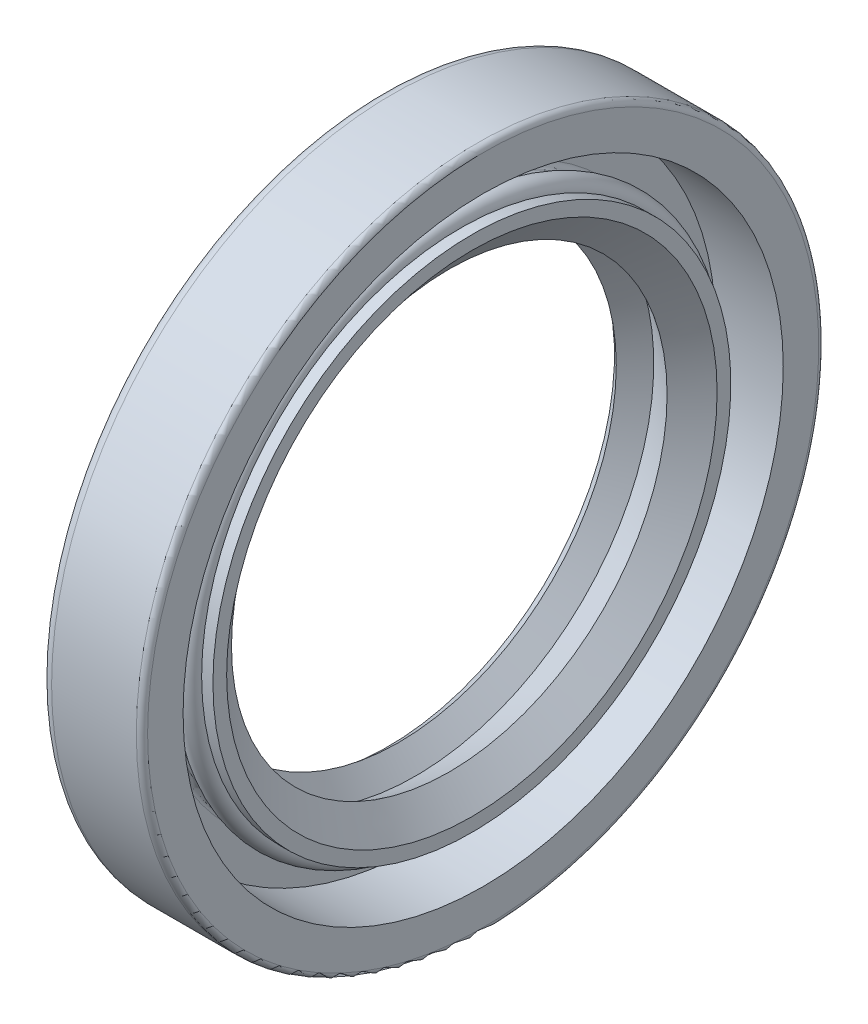
ISO-10303-21;
HEADER;
FILE_DESCRIPTION(('STEP AP214'),'2;1');
FILE_NAME('part.step','',(''),(''),'','','');
FILE_SCHEMA(('AUTOMOTIVE_DESIGN { 1 0 10303 214 1 1 1 1 }'));
ENDSEC;
DATA;
#1=APPLICATION_CONTEXT('core data for automotive mechanical design processes');
#2=APPLICATION_PROTOCOL_DEFINITION('international standard','automotive_design',2000,#1);
#3=PRODUCT_CONTEXT('',#1,'mechanical');
#4=PRODUCT('Part','Part','',(#3));
#5=PRODUCT_RELATED_PRODUCT_CATEGORY('part','',(#4));
#6=PRODUCT_DEFINITION_FORMATION('','',#4);
#7=PRODUCT_DEFINITION_CONTEXT('part definition',#1,'design');
#8=PRODUCT_DEFINITION('design','',#6,#7);
#9=PRODUCT_DEFINITION_SHAPE('','',#8);
#10=(LENGTH_UNIT() NAMED_UNIT(*) SI_UNIT(.MILLI.,.METRE.));
#11=(NAMED_UNIT(*) PLANE_ANGLE_UNIT() SI_UNIT($,.RADIAN.));
#12=(NAMED_UNIT(*) SI_UNIT($,.STERADIAN.) SOLID_ANGLE_UNIT());
#13=UNCERTAINTY_MEASURE_WITH_UNIT(LENGTH_MEASURE(1.E-05),#10,'distance_accuracy_value','');
#14=(GEOMETRIC_REPRESENTATION_CONTEXT(3) GLOBAL_UNCERTAINTY_ASSIGNED_CONTEXT((#13)) GLOBAL_UNIT_ASSIGNED_CONTEXT((#10,
#11,#12)) REPRESENTATION_CONTEXT('',''));
#15=CARTESIAN_POINT('',(0.,0.,0.));
#16=DIRECTION('',(0.,0.,1.));
#17=DIRECTION('',(1.,0.,0.));
#18=AXIS2_PLACEMENT_3D('',#15,#16,#17);
#19=CARTESIAN_POINT('',(0.,-23.144318032822,-22.722222222222));
#20=DIRECTION('',(-1.,0.,0.));
#21=DIRECTION('',(0.,0.,1.));
#22=AXIS2_PLACEMENT_3D('',#19,#20,#21);
#23=PLANE('',#22);
#24=CARTESIAN_POINT('',(0.,0.,0.));
#25=DIRECTION('',(-1.,0.,0.));
#26=DIRECTION('',(0.,0.,-1.));
#27=AXIS2_PLACEMENT_3D('',#24,#25,#26);
#28=CIRCLE('',#27,22.7222222588722);
#29=CARTESIAN_POINT('',(0.,0.,-22.7222222588722));
#30=VERTEX_POINT('',#29);
#31=EDGE_CURVE('E86',#30,#30,#28,.F.);
#32=ORIENTED_EDGE('',*,*,#31,.F.);
#33=EDGE_LOOP('',(#32));
#34=FACE_BOUND('',#33,.T.);
#35=CARTESIAN_POINT('',(0.,0.,0.));
#36=DIRECTION('',(1.,0.,0.));
#37=DIRECTION('',(0.,-1.16841538594905E-09,1.));
#38=AXIS2_PLACEMENT_3D('',#35,#36,#37);
#39=CIRCLE('',#38,20.666666666667);
#40=CARTESIAN_POINT('',(0.,-2.41472513096141E-08,20.666666666667));
#41=VERTEX_POINT('',#40);
#42=EDGE_CURVE('E83',#41,#41,#39,.T.);
#43=ORIENTED_EDGE('',*,*,#42,.T.);
#44=EDGE_LOOP('',(#43));
#45=FACE_BOUND('',#44,.T.);
#46=ADVANCED_FACE('F15',(#34,#45),#23,.T.);
#47=CARTESIAN_POINT('',(0.2,-21.0505777706846,-20.666666666667));
#48=DIRECTION('',(-1.,0.,0.));
#49=DIRECTION('',(0.,0.,1.));
#50=AXIS2_PLACEMENT_3D('',#47,#48,#49);
#51=PLANE('',#50);
#52=CARTESIAN_POINT('',(0.2,0.,0.));
#53=DIRECTION('',(-1.,0.,0.));
#54=DIRECTION('',(0.,0.,-1.));
#55=AXIS2_PLACEMENT_3D('',#52,#53,#54);
#56=CIRCLE('',#55,20.666666666667);
#57=CARTESIAN_POINT('',(0.2,0.,-20.666666666667));
#58=VERTEX_POINT('',#57);
#59=EDGE_CURVE('E80',#58,#58,#56,.F.);
#60=ORIENTED_EDGE('',*,*,#59,.F.);
#61=EDGE_LOOP('',(#60));
#62=FACE_BOUND('',#61,.T.);
#63=CARTESIAN_POINT('',(0.2,0.,0.));
#64=DIRECTION('',(1.,0.,0.));
#65=DIRECTION('',(0.,0.,1.));
#66=AXIS2_PLACEMENT_3D('',#63,#64,#65);
#67=CIRCLE('',#66,17.833333333333);
#68=CARTESIAN_POINT('',(0.2,0.,17.833333333333));
#69=VERTEX_POINT('',#68);
#70=EDGE_CURVE('E77',#69,#69,#67,.T.);
#71=ORIENTED_EDGE('',*,*,#70,.T.);
#72=EDGE_LOOP('',(#71));
#73=FACE_BOUND('',#72,.T.);
#74=ADVANCED_FACE('F94',(#62,#73),#51,.T.);
#75=CARTESIAN_POINT('',(0.,-18.164611452917,-17.833333333333));
#76=DIRECTION('',(-1.,0.,0.));
#77=DIRECTION('',(0.,0.,1.));
#78=AXIS2_PLACEMENT_3D('',#75,#76,#77);
#79=PLANE('',#78);
#80=CARTESIAN_POINT('',(0.,0.,0.));
#81=DIRECTION('',(-1.,0.,0.));
#82=DIRECTION('',(0.,0.,-1.));
#83=AXIS2_PLACEMENT_3D('',#80,#81,#82);
#84=CIRCLE('',#83,17.833333333333);
#85=CARTESIAN_POINT('',(0.,0.,-17.833333333333));
#86=VERTEX_POINT('',#85);
#87=EDGE_CURVE('E74',#86,#86,#84,.F.);
#88=ORIENTED_EDGE('',*,*,#87,.F.);
#89=EDGE_LOOP('',(#88));
#90=FACE_BOUND('',#89,.T.);
#91=CARTESIAN_POINT('',(0.,0.,0.));
#92=DIRECTION('',(1.,0.,0.));
#93=DIRECTION('',(0.,0.,1.));
#94=AXIS2_PLACEMENT_3D('',#91,#92,#93);
#95=CIRCLE('',#94,17.125);
#96=CARTESIAN_POINT('',(0.,0.,17.125));
#97=VERTEX_POINT('',#96);
#98=EDGE_CURVE('E71',#97,#97,#95,.T.);
#99=ORIENTED_EDGE('',*,*,#98,.T.);
#100=EDGE_LOOP('',(#99));
#101=FACE_BOUND('',#100,.T.);
#102=ADVANCED_FACE('F285',(#90,#101),#79,.T.);
#103=CARTESIAN_POINT('',(6.2222223333333,-18.1646114634127,17.833333333333));
#104=DIRECTION('',(1.,0.,0.));
#105=DIRECTION('',(0.,0.,-1.));
#106=AXIS2_PLACEMENT_3D('',#103,#104,#105);
#107=PLANE('',#106);
#108=CARTESIAN_POINT('',(6.2222223333333,0.,0.));
#109=DIRECTION('',(1.,0.,0.));
#110=DIRECTION('',(0.,0.,1.));
#111=AXIS2_PLACEMENT_3D('',#108,#109,#110);
#112=CIRCLE('',#111,17.833333333333);
#113=CARTESIAN_POINT('',(6.2222223333333,0.,17.833333333333));
#114=VERTEX_POINT('',#113);
#115=EDGE_CURVE('E68',#114,#114,#112,.T.);
#116=ORIENTED_EDGE('',*,*,#115,.T.);
#117=EDGE_LOOP('',(#116));
#118=FACE_BOUND('',#117,.T.);
#119=CARTESIAN_POINT('',(6.2222223333333,0.,0.));
#120=DIRECTION('',(-1.,0.,0.));
#121=DIRECTION('',(0.,0.,-1.));
#122=AXIS2_PLACEMENT_3D('',#119,#120,#121);
#123=CIRCLE('',#122,16.88888902381);
#124=CARTESIAN_POINT('',(6.2222223333333,0.,-16.88888902381));
#125=VERTEX_POINT('',#124);
#126=EDGE_CURVE('E65',#125,#125,#123,.F.);
#127=ORIENTED_EDGE('',*,*,#126,.F.);
#128=EDGE_LOOP('',(#127));
#129=FACE_BOUND('',#128,.T.);
#130=ADVANCED_FACE('F276',(#118,#129),#107,.T.);
#131=CARTESIAN_POINT('',(2.3333333333333,-21.0505777347274,20.666666666667));
#132=DIRECTION('',(1.,0.,0.));
#133=DIRECTION('',(0.,0.,-1.));
#134=AXIS2_PLACEMENT_3D('',#131,#132,#133);
#135=PLANE('',#134);
#136=CARTESIAN_POINT('',(2.3333333333333,0.,0.));
#137=DIRECTION('',(1.,0.,0.));
#138=DIRECTION('',(0.,-1.16855669227054E-09,1.));
#139=AXIS2_PLACEMENT_3D('',#136,#137,#138);
#140=CIRCLE('',#139,20.666666666667);
#141=CARTESIAN_POINT('',(2.3333333333333,-2.41501716402581E-08,20.666666666667));
#142=VERTEX_POINT('',#141);
#143=EDGE_CURVE('E62',#142,#142,#140,.T.);
#144=ORIENTED_EDGE('',*,*,#143,.T.);
#145=EDGE_LOOP('',(#144));
#146=FACE_BOUND('',#145,.T.);
#147=CARTESIAN_POINT('',(2.3333333333333,0.,0.));
#148=DIRECTION('',(-1.,0.,0.));
#149=DIRECTION('',(0.,0.,-1.));
#150=AXIS2_PLACEMENT_3D('',#147,#148,#149);
#151=CIRCLE('',#150,18.222222333333);
#152=CARTESIAN_POINT('',(2.3333333333333,0.,-18.222222333333));
#153=VERTEX_POINT('',#152);
#154=EDGE_CURVE('E59',#153,#153,#151,.F.);
#155=ORIENTED_EDGE('',*,*,#154,.F.);
#156=EDGE_LOOP('',(#155));
#157=FACE_BOUND('',#156,.T.);
#158=ADVANCED_FACE('F112',(#146,#157),#135,.T.);
#159=CARTESIAN_POINT('',(7.,-23.5404310553887,23.111111111111));
#160=DIRECTION('',(1.,0.,0.));
#161=DIRECTION('',(0.,0.,-1.));
#162=AXIS2_PLACEMENT_3D('',#159,#160,#161);
#163=PLANE('',#162);
#164=CARTESIAN_POINT('',(7.,0.,0.));
#165=DIRECTION('',(1.,0.,0.));
#166=DIRECTION('',(0.,0.,1.));
#167=AXIS2_PLACEMENT_3D('',#164,#165,#166);
#168=CIRCLE('',#167,23.1111111350048);
#169=CARTESIAN_POINT('',(7.,0.,23.1111111350048));
#170=VERTEX_POINT('',#169);
#171=EDGE_CURVE('E56',#170,#170,#168,.T.);
#172=ORIENTED_EDGE('',*,*,#171,.T.);
#173=EDGE_LOOP('',(#172));
#174=FACE_BOUND('',#173,.T.);
#175=CARTESIAN_POINT('',(7.,0.,0.));
#176=DIRECTION('',(-1.,0.,0.));
#177=DIRECTION('',(0.,0.,-1.));
#178=AXIS2_PLACEMENT_3D('',#175,#176,#177);
#179=CIRCLE('',#178,20.666666666667);
#180=CARTESIAN_POINT('',(7.,0.,-20.666666666667));
#181=VERTEX_POINT('',#180);
#182=EDGE_CURVE('E53',#181,#181,#179,.F.);
#183=ORIENTED_EDGE('',*,*,#182,.F.);
#184=EDGE_LOOP('',(#183));
#185=FACE_BOUND('',#184,.T.);
#186=ADVANCED_FACE('F101',(#174,#185),#163,.T.);
#187=CARTESIAN_POINT('',(7.,0.,0.));
#188=DIRECTION('',(1.,0.,0.));
#189=DIRECTION('',(0.,0.,1.));
#190=AXIS2_PLACEMENT_3D('',#187,#188,#189);
#191=CYLINDRICAL_SURFACE('',#190,20.666666666667);
#192=ORIENTED_EDGE('',*,*,#59,.T.);
#193=EDGE_LOOP('',(#192));
#194=FACE_BOUND('',#193,.T.);
#195=ORIENTED_EDGE('',*,*,#42,.F.);
#196=EDGE_LOOP('',(#195));
#197=FACE_BOUND('',#196,.T.);
#198=ADVANCED_FACE('F98',(#194,#197),#191,.F.);
#199=CARTESIAN_POINT('',(7.,0.,0.));
#200=DIRECTION('',(1.,0.,0.));
#201=DIRECTION('',(0.,1.16844279841197E-09,1.));
#202=AXIS2_PLACEMENT_3D('',#199,#200,#201);
#203=CYLINDRICAL_SURFACE('',#202,17.833333333333);
#204=ORIENTED_EDGE('',*,*,#87,.T.);
#205=EDGE_LOOP('',(#204));
#206=FACE_BOUND('',#205,.T.);
#207=ORIENTED_EDGE('',*,*,#70,.F.);
#208=EDGE_LOOP('',(#207));
#209=FACE_BOUND('',#208,.T.);
#210=ADVANCED_FACE('F100',(#206,#209),#203,.T.);
#211=CARTESIAN_POINT('',(0.,0.,0.));
#212=DIRECTION('',(-1.,0.,0.));
#213=DIRECTION('',(0.,0.,-1.));
#214=AXIS2_PLACEMENT_3D('',#211,#212,#213);
#215=CONICAL_SURFACE('',#214,17.125,0.545655054526771);
#216=ORIENTED_EDGE('',*,*,#98,.F.);
#217=EDGE_LOOP('',(#216));
#218=FACE_BOUND('',#217,.T.);
#219=CARTESIAN_POINT('',(1.1666666666667,0.,0.));
#220=DIRECTION('',(1.,0.,0.));
#221=DIRECTION('',(0.,0.,1.));
#222=AXIS2_PLACEMENT_3D('',#219,#220,#221);
#223=CIRCLE('',#222,16.416666666667);
#224=CARTESIAN_POINT('',(1.1666666666667,0.,16.416666666667));
#225=VERTEX_POINT('',#224);
#226=EDGE_CURVE('E50',#225,#225,#223,.T.);
#227=ORIENTED_EDGE('',*,*,#226,.T.);
#228=EDGE_LOOP('',(#227));
#229=FACE_BOUND('',#228,.T.);
#230=ADVANCED_FACE('F109',(#218,#229),#215,.F.);
#231=CARTESIAN_POINT('',(1.1666666666667,0.,0.));
#232=DIRECTION('',(1.,0.,0.));
#233=DIRECTION('',(0.,0.,1.));
#234=AXIS2_PLACEMENT_3D('',#231,#232,#233);
#235=CONICAL_SURFACE('',#234,16.416666666667,0.881871938580375);
#236=CARTESIAN_POINT('',(0.471477663230241,0.,0.));
#237=DIRECTION('',(1.,0.,0.));
#238=DIRECTION('',(0.,0.,1.));
#239=AXIS2_PLACEMENT_3D('',#236,#237,#238);
#240=CIRCLE('',#239,15.572508591065);
#241=CARTESIAN_POINT('',(0.471477663230241,0.,15.572508591065));
#242=VERTEX_POINT('',#241);
#243=EDGE_CURVE('E47',#242,#242,#240,.T.);
#244=ORIENTED_EDGE('',*,*,#243,.T.);
#245=EDGE_LOOP('',(#244));
#246=FACE_BOUND('',#245,.T.);
#247=ORIENTED_EDGE('',*,*,#226,.F.);
#248=EDGE_LOOP('',(#247));
#249=FACE_BOUND('',#248,.T.);
#250=ADVANCED_FACE('F119',(#246,#249),#235,.T.);
#251=CARTESIAN_POINT('',(0.471477663230238,0.,0.));
#252=DIRECTION('',(-1.,0.,0.));
#253=DIRECTION('',(0.,0.,-1.));
#254=AXIS2_PLACEMENT_3D('',#251,#252,#253);
#255=CONICAL_SURFACE('',#254,15.572508591065,0.688924388214588);
#256=ORIENTED_EDGE('',*,*,#243,.F.);
#257=EDGE_LOOP('',(#256));
#258=FACE_BOUND('',#257,.T.);
#259=CARTESIAN_POINT('',(1.1666666666667,0.,0.));
#260=DIRECTION('',(1.,0.,0.));
#261=DIRECTION('',(0.,0.,1.));
#262=AXIS2_PLACEMENT_3D('',#259,#260,#261);
#263=CIRCLE('',#262,15.);
#264=CARTESIAN_POINT('',(1.1666666666667,0.,15.));
#265=VERTEX_POINT('',#264);
#266=EDGE_CURVE('E44',#265,#265,#263,.T.);
#267=ORIENTED_EDGE('',*,*,#266,.T.);
#268=EDGE_LOOP('',(#267));
#269=FACE_BOUND('',#268,.T.);
#270=ADVANCED_FACE('F123',(#258,#269),#255,.F.);
#271=CARTESIAN_POINT('',(2.3333333333333,0.,0.));
#272=DIRECTION('',(1.,0.,0.));
#273=DIRECTION('',(0.,0.,1.));
#274=AXIS2_PLACEMENT_3D('',#271,#272,#273);
#275=CONICAL_SURFACE('',#274,16.416666666667,0.881871938580179);
#276=CARTESIAN_POINT('',(2.3333333333333,0.,0.));
#277=DIRECTION('',(1.,0.,0.));
#278=DIRECTION('',(0.,0.,1.));
#279=AXIS2_PLACEMENT_3D('',#276,#277,#278);
#280=CIRCLE('',#279,16.416666666667);
#281=CARTESIAN_POINT('',(2.3333333333333,0.,16.416666666667));
#282=VERTEX_POINT('',#281);
#283=EDGE_CURVE('E41',#282,#282,#280,.T.);
#284=ORIENTED_EDGE('',*,*,#283,.T.);
#285=EDGE_LOOP('',(#284));
#286=FACE_BOUND('',#285,.T.);
#287=ORIENTED_EDGE('',*,*,#266,.F.);
#288=EDGE_LOOP('',(#287));
#289=FACE_BOUND('',#288,.T.);
#290=ADVANCED_FACE('F127',(#286,#289),#275,.F.);
#291=CARTESIAN_POINT('',(2.33333333333329,0.,0.));
#292=DIRECTION('',(-1.,0.,0.));
#293=DIRECTION('',(0.,0.,-1.));
#294=AXIS2_PLACEMENT_3D('',#291,#292,#293);
#295=CONICAL_SURFACE('',#294,16.416666666667,0.545655054527085);
#296=ORIENTED_EDGE('',*,*,#283,.F.);
#297=EDGE_LOOP('',(#296));
#298=FACE_BOUND('',#297,.T.);
#299=CARTESIAN_POINT('',(4.6666666666667,0.,0.));
#300=DIRECTION('',(1.,0.,0.));
#301=DIRECTION('',(0.,0.,1.));
#302=AXIS2_PLACEMENT_3D('',#299,#300,#301);
#303=CIRCLE('',#302,15.);
#304=CARTESIAN_POINT('',(4.6666666666667,0.,15.));
#305=VERTEX_POINT('',#304);
#306=EDGE_CURVE('E38',#305,#305,#303,.T.);
#307=ORIENTED_EDGE('',*,*,#306,.T.);
#308=EDGE_LOOP('',(#307));
#309=FACE_BOUND('',#308,.T.);
#310=ADVANCED_FACE('F131',(#298,#309),#295,.F.);
#311=CARTESIAN_POINT('',(6.2222223333333,0.,0.));
#312=DIRECTION('',(1.,0.,0.));
#313=DIRECTION('',(0.,0.,1.));
#314=AXIS2_PLACEMENT_3D('',#311,#312,#313);
#315=CONICAL_SURFACE('',#314,16.88888902381,0.88187193858018);
#316=ORIENTED_EDGE('',*,*,#126,.T.);
#317=EDGE_LOOP('',(#316));
#318=FACE_BOUND('',#317,.T.);
#319=ORIENTED_EDGE('',*,*,#306,.F.);
#320=EDGE_LOOP('',(#319));
#321=FACE_BOUND('',#320,.T.);
#322=ADVANCED_FACE('F135',(#318,#321),#315,.F.);
#323=CARTESIAN_POINT('',(7.,0.,0.));
#324=DIRECTION('',(1.,0.,0.));
#325=DIRECTION('',(0.,0.,1.));
#326=AXIS2_PLACEMENT_3D('',#323,#324,#325);
#327=CYLINDRICAL_SURFACE('',#326,17.833333333333);
#328=CARTESIAN_POINT('',(5.4444446666667,0.,0.));
#329=DIRECTION('',(1.,0.,0.));
#330=DIRECTION('',(0.,0.,1.));
#331=AXIS2_PLACEMENT_3D('',#328,#329,#330);
#332=CIRCLE('',#331,17.833333333333);
#333=CARTESIAN_POINT('',(5.4444446666667,0.,17.833333333333));
#334=VERTEX_POINT('',#333);
#335=EDGE_CURVE('E35',#334,#334,#332,.T.);
#336=ORIENTED_EDGE('',*,*,#335,.T.);
#337=EDGE_LOOP('',(#336));
#338=FACE_BOUND('',#337,.T.);
#339=ORIENTED_EDGE('',*,*,#115,.F.);
#340=EDGE_LOOP('',(#339));
#341=FACE_BOUND('',#340,.T.);
#342=ADVANCED_FACE('F139',(#338,#341),#327,.T.);
#343=CARTESIAN_POINT('',(4.6666666666667,0.,0.));
#344=DIRECTION('',(1.,0.,0.));
#345=DIRECTION('',(0.,0.,1.));
#346=AXIS2_PLACEMENT_3D('',#343,#344,#345);
#347=TOROIDAL_SURFACE('',#346,17.833333333333,0.777778);
#348=CARTESIAN_POINT('',(3.8888886666667,0.,0.));
#349=DIRECTION('',(1.,0.,0.));
#350=DIRECTION('',(0.,0.,1.));
#351=AXIS2_PLACEMENT_3D('',#348,#349,#350);
#352=CIRCLE('',#351,17.833333333333);
#353=CARTESIAN_POINT('',(3.8888886666667,0.,17.833333333333));
#354=VERTEX_POINT('',#353);
#355=EDGE_CURVE('E30',#354,#354,#352,.T.);
#356=ORIENTED_EDGE('',*,*,#355,.T.);
#357=EDGE_LOOP('',(#356));
#358=FACE_BOUND('',#357,.T.);
#359=ORIENTED_EDGE('',*,*,#335,.F.);
#360=EDGE_LOOP('',(#359));
#361=FACE_BOUND('',#360,.T.);
#362=ADVANCED_FACE('F143',(#358,#361),#347,.T.);
#363=CARTESIAN_POINT('',(7.,0.,0.));
#364=DIRECTION('',(1.,0.,0.));
#365=DIRECTION('',(0.,0.,1.));
#366=AXIS2_PLACEMENT_3D('',#363,#364,#365);
#367=CYLINDRICAL_SURFACE('',#366,17.833333333333);
#368=CARTESIAN_POINT('',(2.7222223333333,0.,0.));
#369=DIRECTION('',(1.,0.,0.));
#370=DIRECTION('',(0.,0.,1.));
#371=AXIS2_PLACEMENT_3D('',#368,#369,#370);
#372=CIRCLE('',#371,17.833333333333);
#373=CARTESIAN_POINT('',(2.7222223333333,0.,17.833333333333));
#374=VERTEX_POINT('',#373);
#375=EDGE_CURVE('E26',#374,#374,#372,.T.);
#376=ORIENTED_EDGE('',*,*,#375,.T.);
#377=EDGE_LOOP('',(#376));
#378=FACE_BOUND('',#377,.T.);
#379=ORIENTED_EDGE('',*,*,#355,.F.);
#380=EDGE_LOOP('',(#379));
#381=FACE_BOUND('',#380,.T.);
#382=ADVANCED_FACE('F147',(#378,#381),#367,.T.);
#383=CARTESIAN_POINT('',(2.72222233333315,0.,0.));
#384=DIRECTION('',(1.,0.,0.));
#385=DIRECTION('',(0.,0.,1.));
#386=AXIS2_PLACEMENT_3D('',#383,#384,#385);
#387=TOROIDAL_SURFACE('',#386,18.2222223333329,0.388888999999844);
#388=ORIENTED_EDGE('',*,*,#154,.T.);
#389=EDGE_LOOP('',(#388));
#390=FACE_BOUND('',#389,.T.);
#391=ORIENTED_EDGE('',*,*,#375,.F.);
#392=EDGE_LOOP('',(#391));
#393=FACE_BOUND('',#392,.T.);
#394=ADVANCED_FACE('F151',(#390,#393),#387,.F.);
#395=CARTESIAN_POINT('',(7.,0.,0.));
#396=DIRECTION('',(1.,0.,0.));
#397=DIRECTION('',(0.,0.,1.));
#398=AXIS2_PLACEMENT_3D('',#395,#396,#397);
#399=CYLINDRICAL_SURFACE('',#398,20.666666666667);
#400=ORIENTED_EDGE('',*,*,#182,.T.);
#401=EDGE_LOOP('',(#400));
#402=FACE_BOUND('',#401,.T.);
#403=ORIENTED_EDGE('',*,*,#143,.F.);
#404=EDGE_LOOP('',(#403));
#405=FACE_BOUND('',#404,.T.);
#406=ADVANCED_FACE('F155',(#402,#405),#399,.F.);
#407=CARTESIAN_POINT('',(6.61111111111181,0.,0.));
#408=DIRECTION('',(1.,0.,0.));
#409=DIRECTION('',(0.,0.,1.));
#410=AXIS2_PLACEMENT_3D('',#407,#408,#409);
#411=TOROIDAL_SURFACE('',#410,23.1111111111118,0.388888888888191);
#412=CARTESIAN_POINT('',(6.61111111111181,0.,0.));
#413=DIRECTION('',(1.,0.,0.));
#414=DIRECTION('',(0.,0.,1.));
#415=AXIS2_PLACEMENT_3D('',#412,#413,#414);
#416=CIRCLE('',#415,23.5);
#417=CARTESIAN_POINT('',(6.61111111111181,0.,23.5));
#418=VERTEX_POINT('',#417);
#419=EDGE_CURVE('E22',#418,#418,#416,.T.);
#420=ORIENTED_EDGE('',*,*,#419,.T.);
#421=EDGE_LOOP('',(#420));
#422=FACE_BOUND('',#421,.T.);
#423=ORIENTED_EDGE('',*,*,#171,.F.);
#424=EDGE_LOOP('',(#423));
#425=FACE_BOUND('',#424,.T.);
#426=ADVANCED_FACE('F159',(#422,#425),#411,.T.);
#427=CARTESIAN_POINT('',(7.,0.,0.));
#428=DIRECTION('',(1.,0.,0.));
#429=DIRECTION('',(0.,0.,1.));
#430=AXIS2_PLACEMENT_3D('',#427,#428,#429);
#431=CYLINDRICAL_SURFACE('',#430,23.5);
#432=CARTESIAN_POINT('',(0.77777777777786,0.,0.));
#433=DIRECTION('',(1.,0.,0.));
#434=DIRECTION('',(0.,0.,1.));
#435=AXIS2_PLACEMENT_3D('',#432,#433,#434);
#436=CIRCLE('',#435,23.5);
#437=CARTESIAN_POINT('',(0.77777777777786,0.,23.5));
#438=VERTEX_POINT('',#437);
#439=EDGE_CURVE('E10',#438,#438,#436,.T.);
#440=ORIENTED_EDGE('',*,*,#439,.T.);
#441=EDGE_LOOP('',(#440));
#442=FACE_BOUND('',#441,.T.);
#443=ORIENTED_EDGE('',*,*,#419,.F.);
#444=EDGE_LOOP('',(#443));
#445=FACE_BOUND('',#444,.T.);
#446=ADVANCED_FACE('F162',(#442,#445),#431,.T.);
#447=CARTESIAN_POINT('',(0.777777777777939,0.,0.));
#448=DIRECTION('',(1.,0.,0.));
#449=DIRECTION('',(0.,0.,1.));
#450=AXIS2_PLACEMENT_3D('',#447,#448,#449);
#451=TOROIDAL_SURFACE('',#450,22.7222222222221,0.77777777777794);
#452=ORIENTED_EDGE('',*,*,#31,.T.);
#453=EDGE_LOOP('',(#452));
#454=FACE_BOUND('',#453,.T.);
#455=ORIENTED_EDGE('',*,*,#439,.F.);
#456=EDGE_LOOP('',(#455));
#457=FACE_BOUND('',#456,.T.);
#458=ADVANCED_FACE('F17',(#454,#457),#451,.T.);
#459=CLOSED_SHELL('',(#46,#74,#102,#130,#158,#186,#198,#210,#230,#250,#270,#290,#310,#322,#342,
#362,#382,#394,#406,#426,#446,#458));
#460=MANIFOLD_SOLID_BREP('B1',#459);
#461=ADVANCED_BREP_SHAPE_REPRESENTATION('',(#18,#460),#14);
#462=SHAPE_DEFINITION_REPRESENTATION(#9,#461);
ENDSEC;
END-ISO-10303-21;
